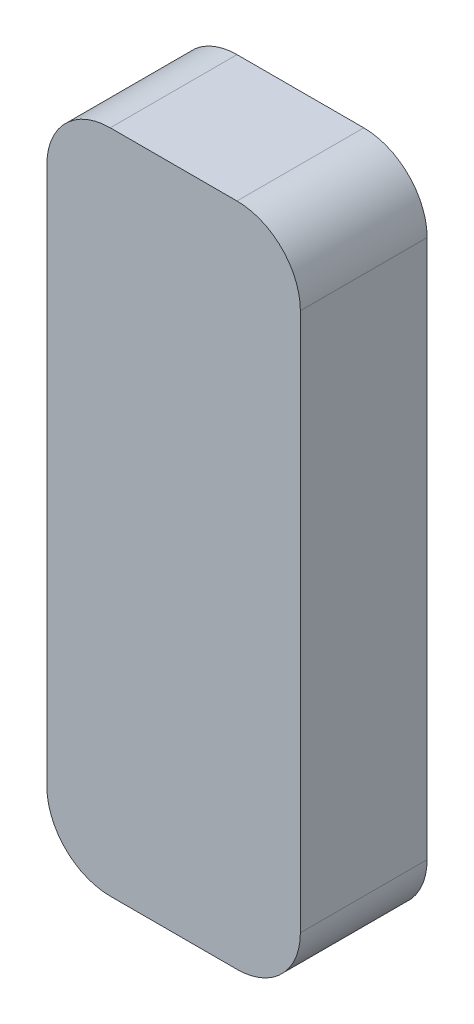
ISO-10303-21;
HEADER;
FILE_DESCRIPTION(('STEP AP214'),'2;1');
FILE_NAME('part.step','',(''),(''),'','','');
FILE_SCHEMA(('AUTOMOTIVE_DESIGN { 1 0 10303 214 1 1 1 1 }'));
ENDSEC;
DATA;
#1=APPLICATION_CONTEXT('core data for automotive mechanical design processes');
#2=APPLICATION_PROTOCOL_DEFINITION('international standard','automotive_design',2000,#1);
#3=PRODUCT_CONTEXT('',#1,'mechanical');
#4=PRODUCT('Part','Part','',(#3));
#5=PRODUCT_RELATED_PRODUCT_CATEGORY('part','',(#4));
#6=PRODUCT_DEFINITION_FORMATION('','',#4);
#7=PRODUCT_DEFINITION_CONTEXT('part definition',#1,'design');
#8=PRODUCT_DEFINITION('design','',#6,#7);
#9=PRODUCT_DEFINITION_SHAPE('','',#8);
#10=(LENGTH_UNIT() NAMED_UNIT(*) SI_UNIT(.MILLI.,.METRE.));
#11=(NAMED_UNIT(*) PLANE_ANGLE_UNIT() SI_UNIT($,.RADIAN.));
#12=(NAMED_UNIT(*) SI_UNIT($,.STERADIAN.) SOLID_ANGLE_UNIT());
#13=UNCERTAINTY_MEASURE_WITH_UNIT(LENGTH_MEASURE(1.E-05),#10,'distance_accuracy_value','');
#14=(GEOMETRIC_REPRESENTATION_CONTEXT(3) GLOBAL_UNCERTAINTY_ASSIGNED_CONTEXT((#13)) GLOBAL_UNIT_ASSIGNED_CONTEXT((#10,
#11,#12)) REPRESENTATION_CONTEXT('',''));
#15=CARTESIAN_POINT('',(0.,0.,0.));
#16=DIRECTION('',(0.,0.,1.));
#17=DIRECTION('',(1.,0.,0.));
#18=AXIS2_PLACEMENT_3D('',#15,#16,#17);
#19=CARTESIAN_POINT('',(10.,-42.5,20.));
#20=DIRECTION('',(0.,0.,-1.));
#21=DIRECTION('',(-1.,0.,0.));
#22=AXIS2_PLACEMENT_3D('',#19,#20,#21);
#23=CYLINDRICAL_SURFACE('',#22,10.);
#24=CARTESIAN_POINT('',(10.,-42.5,0.));
#25=DIRECTION('',(0.,0.,1.));
#26=DIRECTION('',(1.,0.,0.));
#27=AXIS2_PLACEMENT_3D('',#24,#25,#26);
#28=CIRCLE('',#27,10.);
#29=CARTESIAN_POINT('',(9.99999999999993,-52.5,0.));
#30=VERTEX_POINT('',#29);
#31=CARTESIAN_POINT('',(20.,-42.4999999999999,0.));
#32=VERTEX_POINT('',#31);
#33=EDGE_CURVE('E131',#30,#32,#28,.T.);
#34=ORIENTED_EDGE('',*,*,#33,.T.);
#35=DIRECTION('',(0.,0.,-1.));
#36=VECTOR('',#35,1.);
#37=CARTESIAN_POINT('',(20.,-42.4999999999999,20.));
#38=LINE('',#37,#36);
#39=CARTESIAN_POINT('',(20.,-42.4999999999999,20.));
#40=VERTEX_POINT('',#39);
#41=EDGE_CURVE('E11',#40,#32,#38,.T.);
#42=ORIENTED_EDGE('',*,*,#41,.F.);
#43=CARTESIAN_POINT('',(10.,-42.5,20.));
#44=DIRECTION('',(0.,0.,1.));
#45=DIRECTION('',(1.,0.,0.));
#46=AXIS2_PLACEMENT_3D('',#43,#44,#45);
#47=CIRCLE('',#46,10.);
#48=CARTESIAN_POINT('',(9.99999999999993,-52.5,20.));
#49=VERTEX_POINT('',#48);
#50=EDGE_CURVE('E145',#49,#40,#47,.T.);
#51=ORIENTED_EDGE('',*,*,#50,.F.);
#52=DIRECTION('',(0.,0.,-1.));
#53=VECTOR('',#52,1.);
#54=CARTESIAN_POINT('',(9.99999999999993,-52.5,20.));
#55=LINE('',#54,#53);
#56=EDGE_CURVE('E127',#49,#30,#55,.T.);
#57=ORIENTED_EDGE('',*,*,#56,.T.);
#58=EDGE_LOOP('',(#34,#42,#51,#57));
#59=FACE_BOUND('',#58,.T.);
#60=ADVANCED_FACE('F35',(#59),#23,.T.);
#61=CARTESIAN_POINT('',(20.,-42.4999999999999,20.));
#62=DIRECTION('',(-1.,0.,0.));
#63=DIRECTION('',(0.,-1.,0.));
#64=AXIS2_PLACEMENT_3D('',#61,#62,#63);
#65=PLANE('',#64);
#66=DIRECTION('',(0.,1.,0.));
#67=VECTOR('',#66,1.);
#68=CARTESIAN_POINT('',(20.,-42.4999999999999,0.));
#69=LINE('',#68,#67);
#70=CARTESIAN_POINT('',(20.,42.4999999999999,0.));
#71=VERTEX_POINT('',#70);
#72=EDGE_CURVE('E134',#32,#71,#69,.T.);
#73=ORIENTED_EDGE('',*,*,#72,.T.);
#74=DIRECTION('',(0.,0.,-1.));
#75=VECTOR('',#74,1.);
#76=CARTESIAN_POINT('',(20.,42.4999999999999,20.));
#77=LINE('',#76,#75);
#78=CARTESIAN_POINT('',(20.,42.4999999999999,20.));
#79=VERTEX_POINT('',#78);
#80=EDGE_CURVE('E43',#79,#71,#77,.T.);
#81=ORIENTED_EDGE('',*,*,#80,.F.);
#82=DIRECTION('',(0.,1.,0.));
#83=VECTOR('',#82,1.);
#84=CARTESIAN_POINT('',(20.,-42.4999999999999,20.));
#85=LINE('',#84,#83);
#86=EDGE_CURVE('E94',#40,#79,#85,.T.);
#87=ORIENTED_EDGE('',*,*,#86,.F.);
#88=ORIENTED_EDGE('',*,*,#41,.T.);
#89=EDGE_LOOP('',(#73,#81,#87,#88));
#90=FACE_BOUND('',#89,.T.);
#91=ADVANCED_FACE('F180',(#90),#65,.F.);
#92=CARTESIAN_POINT('',(10.,42.5,20.));
#93=DIRECTION('',(0.,0.,-1.));
#94=DIRECTION('',(-1.,0.,0.));
#95=AXIS2_PLACEMENT_3D('',#92,#93,#94);
#96=CYLINDRICAL_SURFACE('',#95,10.);
#97=CARTESIAN_POINT('',(10.,42.5,0.));
#98=DIRECTION('',(0.,0.,1.));
#99=DIRECTION('',(-1.,0.,0.));
#100=AXIS2_PLACEMENT_3D('',#97,#98,#99);
#101=CIRCLE('',#100,10.);
#102=CARTESIAN_POINT('',(9.99999999999993,52.5,0.));
#103=VERTEX_POINT('',#102);
#104=EDGE_CURVE('E136',#71,#103,#101,.T.);
#105=ORIENTED_EDGE('',*,*,#104,.T.);
#106=DIRECTION('',(0.,0.,-1.));
#107=VECTOR('',#106,1.);
#108=CARTESIAN_POINT('',(9.99999999999993,52.5,20.));
#109=LINE('',#108,#107);
#110=CARTESIAN_POINT('',(9.99999999999993,52.5,20.));
#111=VERTEX_POINT('',#110);
#112=EDGE_CURVE('E152',#111,#103,#109,.T.);
#113=ORIENTED_EDGE('',*,*,#112,.F.);
#114=CARTESIAN_POINT('',(10.,42.5,20.));
#115=DIRECTION('',(0.,0.,1.));
#116=DIRECTION('',(-1.,0.,0.));
#117=AXIS2_PLACEMENT_3D('',#114,#115,#116);
#118=CIRCLE('',#117,10.);
#119=EDGE_CURVE('E160',#79,#111,#118,.T.);
#120=ORIENTED_EDGE('',*,*,#119,.F.);
#121=ORIENTED_EDGE('',*,*,#80,.T.);
#122=EDGE_LOOP('',(#105,#113,#120,#121));
#123=FACE_BOUND('',#122,.T.);
#124=ADVANCED_FACE('F158',(#123),#96,.T.);
#125=CARTESIAN_POINT('',(-9.99999999999993,52.5,20.));
#126=DIRECTION('',(0.,-1.,0.));
#127=DIRECTION('',(0.,0.,-1.));
#128=AXIS2_PLACEMENT_3D('',#125,#126,#127);
#129=PLANE('',#128);
#130=DIRECTION('',(-1.,0.,0.));
#131=VECTOR('',#130,1.);
#132=CARTESIAN_POINT('',(-9.99999999999993,52.5,0.));
#133=LINE('',#132,#131);
#134=CARTESIAN_POINT('',(-9.99999999999993,52.5,0.));
#135=VERTEX_POINT('',#134);
#136=EDGE_CURVE('E138',#103,#135,#133,.T.);
#137=ORIENTED_EDGE('',*,*,#136,.T.);
#138=DIRECTION('',(0.,0.,-1.));
#139=VECTOR('',#138,1.);
#140=CARTESIAN_POINT('',(-9.99999999999993,52.5,20.));
#141=LINE('',#140,#139);
#142=CARTESIAN_POINT('',(-9.99999999999993,52.5,20.));
#143=VERTEX_POINT('',#142);
#144=EDGE_CURVE('E149',#143,#135,#141,.T.);
#145=ORIENTED_EDGE('',*,*,#144,.F.);
#146=DIRECTION('',(-1.,0.,0.));
#147=VECTOR('',#146,1.);
#148=CARTESIAN_POINT('',(-9.99999999999993,52.5,20.));
#149=LINE('',#148,#147);
#150=EDGE_CURVE('E172',#111,#143,#149,.T.);
#151=ORIENTED_EDGE('',*,*,#150,.F.);
#152=ORIENTED_EDGE('',*,*,#112,.T.);
#153=EDGE_LOOP('',(#137,#145,#151,#152));
#154=FACE_BOUND('',#153,.T.);
#155=ADVANCED_FACE('F168',(#154),#129,.F.);
#156=CARTESIAN_POINT('',(-10.,42.5,20.));
#157=DIRECTION('',(0.,0.,-1.));
#158=DIRECTION('',(-1.,0.,0.));
#159=AXIS2_PLACEMENT_3D('',#156,#157,#158);
#160=CYLINDRICAL_SURFACE('',#159,10.);
#161=CARTESIAN_POINT('',(-10.,42.5,0.));
#162=DIRECTION('',(0.,0.,1.));
#163=DIRECTION('',(-1.,0.,0.));
#164=AXIS2_PLACEMENT_3D('',#161,#162,#163);
#165=CIRCLE('',#164,10.);
#166=CARTESIAN_POINT('',(-20.,42.4999999999999,0.));
#167=VERTEX_POINT('',#166);
#168=EDGE_CURVE('E140',#135,#167,#165,.T.);
#169=ORIENTED_EDGE('',*,*,#168,.T.);
#170=DIRECTION('',(0.,0.,-1.));
#171=VECTOR('',#170,1.);
#172=CARTESIAN_POINT('',(-20.,42.4999999999999,20.));
#173=LINE('',#172,#171);
#174=CARTESIAN_POINT('',(-20.,42.4999999999999,20.));
#175=VERTEX_POINT('',#174);
#176=EDGE_CURVE('E122',#175,#167,#173,.T.);
#177=ORIENTED_EDGE('',*,*,#176,.F.);
#178=CARTESIAN_POINT('',(-10.,42.5,20.));
#179=DIRECTION('',(0.,0.,1.));
#180=DIRECTION('',(-1.,0.,0.));
#181=AXIS2_PLACEMENT_3D('',#178,#179,#180);
#182=CIRCLE('',#181,10.);
#183=EDGE_CURVE('E113',#143,#175,#182,.T.);
#184=ORIENTED_EDGE('',*,*,#183,.F.);
#185=ORIENTED_EDGE('',*,*,#144,.T.);
#186=EDGE_LOOP('',(#169,#177,#184,#185));
#187=FACE_BOUND('',#186,.T.);
#188=ADVANCED_FACE('F171',(#187),#160,.T.);
#189=CARTESIAN_POINT('',(-20.,-42.4999999999999,20.));
#190=DIRECTION('',(1.,0.,0.));
#191=DIRECTION('',(0.,0.,-1.));
#192=AXIS2_PLACEMENT_3D('',#189,#190,#191);
#193=PLANE('',#192);
#194=DIRECTION('',(0.,-1.,0.));
#195=VECTOR('',#194,1.);
#196=CARTESIAN_POINT('',(-20.,-42.4999999999999,0.));
#197=LINE('',#196,#195);
#198=CARTESIAN_POINT('',(-20.,-42.5,0.));
#199=VERTEX_POINT('',#198);
#200=EDGE_CURVE('E121',#167,#199,#197,.T.);
#201=ORIENTED_EDGE('',*,*,#200,.T.);
#202=DIRECTION('',(0.,0.,-1.));
#203=VECTOR('',#202,1.);
#204=CARTESIAN_POINT('',(-20.,-42.5,20.));
#205=LINE('',#204,#203);
#206=CARTESIAN_POINT('',(-20.,-42.5,20.));
#207=VERTEX_POINT('',#206);
#208=EDGE_CURVE('E118',#207,#199,#205,.T.);
#209=ORIENTED_EDGE('',*,*,#208,.F.);
#210=DIRECTION('',(0.,-1.,0.));
#211=VECTOR('',#210,1.);
#212=CARTESIAN_POINT('',(-20.,-42.4999999999999,20.));
#213=LINE('',#212,#211);
#214=EDGE_CURVE('E107',#175,#207,#213,.T.);
#215=ORIENTED_EDGE('',*,*,#214,.F.);
#216=ORIENTED_EDGE('',*,*,#176,.T.);
#217=EDGE_LOOP('',(#201,#209,#215,#216));
#218=FACE_BOUND('',#217,.T.);
#219=ADVANCED_FACE('F119',(#218),#193,.F.);
#220=CARTESIAN_POINT('',(-10.,-42.5,20.));
#221=DIRECTION('',(0.,0.,-1.));
#222=DIRECTION('',(-1.,0.,0.));
#223=AXIS2_PLACEMENT_3D('',#220,#221,#222);
#224=CYLINDRICAL_SURFACE('',#223,10.);
#225=CARTESIAN_POINT('',(-10.,-42.5,0.));
#226=DIRECTION('',(0.,0.,1.));
#227=DIRECTION('',(-1.,0.,0.));
#228=AXIS2_PLACEMENT_3D('',#225,#226,#227);
#229=CIRCLE('',#228,10.);
#230=CARTESIAN_POINT('',(-9.99999999999993,-52.5,0.));
#231=VERTEX_POINT('',#230);
#232=EDGE_CURVE('E80',#199,#231,#229,.T.);
#233=ORIENTED_EDGE('',*,*,#232,.T.);
#234=DIRECTION('',(0.,0.,-1.));
#235=VECTOR('',#234,1.);
#236=CARTESIAN_POINT('',(-9.99999999999993,-52.5,20.));
#237=LINE('',#236,#235);
#238=CARTESIAN_POINT('',(-9.99999999999993,-52.5,20.));
#239=VERTEX_POINT('',#238);
#240=EDGE_CURVE('E123',#239,#231,#237,.T.);
#241=ORIENTED_EDGE('',*,*,#240,.F.);
#242=CARTESIAN_POINT('',(-10.,-42.5,20.));
#243=DIRECTION('',(0.,0.,1.));
#244=DIRECTION('',(-1.,0.,0.));
#245=AXIS2_PLACEMENT_3D('',#242,#243,#244);
#246=CIRCLE('',#245,10.);
#247=EDGE_CURVE('E111',#207,#239,#246,.T.);
#248=ORIENTED_EDGE('',*,*,#247,.F.);
#249=ORIENTED_EDGE('',*,*,#208,.T.);
#250=EDGE_LOOP('',(#233,#241,#248,#249));
#251=FACE_BOUND('',#250,.T.);
#252=ADVANCED_FACE('F125',(#251),#224,.T.);
#253=CARTESIAN_POINT('',(-9.99999999999993,-52.5,20.));
#254=DIRECTION('',(0.,1.,0.));
#255=DIRECTION('',(0.,0.,1.));
#256=AXIS2_PLACEMENT_3D('',#253,#254,#255);
#257=PLANE('',#256);
#258=DIRECTION('',(1.,0.,0.));
#259=VECTOR('',#258,1.);
#260=CARTESIAN_POINT('',(-9.99999999999993,-52.5,0.));
#261=LINE('',#260,#259);
#262=EDGE_CURVE('E86',#231,#30,#261,.T.);
#263=ORIENTED_EDGE('',*,*,#262,.T.);
#264=ORIENTED_EDGE('',*,*,#56,.F.);
#265=DIRECTION('',(1.,0.,0.));
#266=VECTOR('',#265,1.);
#267=CARTESIAN_POINT('',(-9.99999999999993,-52.5,20.));
#268=LINE('',#267,#266);
#269=EDGE_CURVE('E51',#239,#49,#268,.T.);
#270=ORIENTED_EDGE('',*,*,#269,.F.);
#271=ORIENTED_EDGE('',*,*,#240,.T.);
#272=EDGE_LOOP('',(#263,#264,#270,#271));
#273=FACE_BOUND('',#272,.T.);
#274=ADVANCED_FACE('F196',(#273),#257,.F.);
#275=CARTESIAN_POINT('',(10.,-42.5,20.));
#276=DIRECTION('',(0.,0.,1.));
#277=DIRECTION('',(1.,0.,0.));
#278=AXIS2_PLACEMENT_3D('',#275,#276,#277);
#279=PLANE('',#278);
#280=ORIENTED_EDGE('',*,*,#50,.T.);
#281=ORIENTED_EDGE('',*,*,#86,.T.);
#282=ORIENTED_EDGE('',*,*,#119,.T.);
#283=ORIENTED_EDGE('',*,*,#150,.T.);
#284=ORIENTED_EDGE('',*,*,#183,.T.);
#285=ORIENTED_EDGE('',*,*,#214,.T.);
#286=ORIENTED_EDGE('',*,*,#247,.T.);
#287=ORIENTED_EDGE('',*,*,#269,.T.);
#288=EDGE_LOOP('',(#280,#281,#282,#283,#284,#285,#286,#287));
#289=FACE_BOUND('',#288,.T.);
#290=ADVANCED_FACE('F109',(#289),#279,.T.);
#291=CARTESIAN_POINT('',(10.,-42.5,0.));
#292=DIRECTION('',(0.,0.,1.));
#293=DIRECTION('',(1.,0.,0.));
#294=AXIS2_PLACEMENT_3D('',#291,#292,#293);
#295=PLANE('',#294);
#296=ORIENTED_EDGE('',*,*,#33,.F.);
#297=ORIENTED_EDGE('',*,*,#262,.F.);
#298=ORIENTED_EDGE('',*,*,#232,.F.);
#299=ORIENTED_EDGE('',*,*,#200,.F.);
#300=ORIENTED_EDGE('',*,*,#168,.F.);
#301=ORIENTED_EDGE('',*,*,#136,.F.);
#302=ORIENTED_EDGE('',*,*,#104,.F.);
#303=ORIENTED_EDGE('',*,*,#72,.F.);
#304=EDGE_LOOP('',(#296,#297,#298,#299,#300,#301,#302,#303));
#305=FACE_BOUND('',#304,.T.);
#306=ADVANCED_FACE('F164',(#305),#295,.F.);
#307=CLOSED_SHELL('',(#60,#91,#124,#155,#188,#219,#252,#274,#290,#306));
#308=MANIFOLD_SOLID_BREP('B2',#307);
#309=ADVANCED_BREP_SHAPE_REPRESENTATION('',(#18,#308),#14);
#310=SHAPE_DEFINITION_REPRESENTATION(#9,#309);
ENDSEC;
END-ISO-10303-21;
